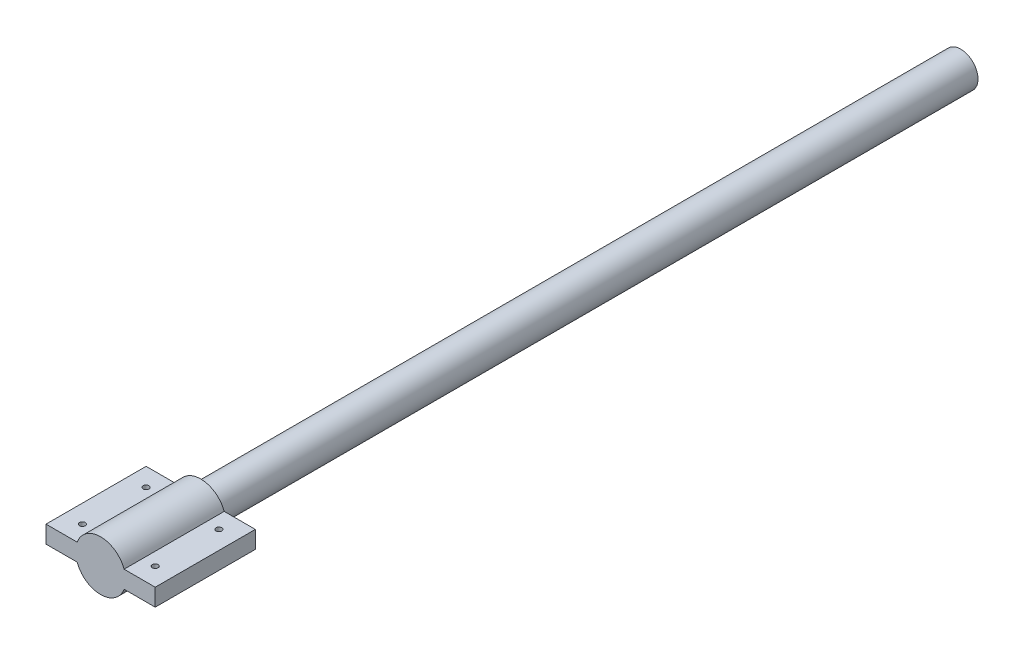
ISO-10303-21;
HEADER;
FILE_DESCRIPTION(('STEP AP214'),'2;1');
FILE_NAME('part.step','',(''),(''),'','','');
FILE_SCHEMA(('AUTOMOTIVE_DESIGN { 1 0 10303 214 1 1 1 1 }'));
ENDSEC;
DATA;
#1=APPLICATION_CONTEXT('core data for automotive mechanical design processes');
#2=APPLICATION_PROTOCOL_DEFINITION('international standard','automotive_design',2000,#1);
#3=PRODUCT_CONTEXT('',#1,'mechanical');
#4=PRODUCT('Part','Part','',(#3));
#5=PRODUCT_RELATED_PRODUCT_CATEGORY('part','',(#4));
#6=PRODUCT_DEFINITION_FORMATION('','',#4);
#7=PRODUCT_DEFINITION_CONTEXT('part definition',#1,'design');
#8=PRODUCT_DEFINITION('design','',#6,#7);
#9=PRODUCT_DEFINITION_SHAPE('','',#8);
#10=(LENGTH_UNIT() NAMED_UNIT(*) SI_UNIT(.MILLI.,.METRE.));
#11=(NAMED_UNIT(*) PLANE_ANGLE_UNIT() SI_UNIT($,.RADIAN.));
#12=(NAMED_UNIT(*) SI_UNIT($,.STERADIAN.) SOLID_ANGLE_UNIT());
#13=UNCERTAINTY_MEASURE_WITH_UNIT(LENGTH_MEASURE(1.E-05),#10,'distance_accuracy_value','');
#14=(GEOMETRIC_REPRESENTATION_CONTEXT(3) GLOBAL_UNCERTAINTY_ASSIGNED_CONTEXT((#13)) GLOBAL_UNIT_ASSIGNED_CONTEXT((#10,
#11,#12)) REPRESENTATION_CONTEXT('',''));
#15=CARTESIAN_POINT('',(0.,0.,0.));
#16=DIRECTION('',(0.,0.,1.));
#17=DIRECTION('',(1.,0.,0.));
#18=AXIS2_PLACEMENT_3D('',#15,#16,#17);
#19=CARTESIAN_POINT('',(0.,0.,945.));
#20=DIRECTION('',(0.,0.,-1.));
#21=DIRECTION('',(-1.,0.,0.));
#22=AXIS2_PLACEMENT_3D('',#19,#20,#21);
#23=CYLINDRICAL_SURFACE('',#22,19.);
#24=CARTESIAN_POINT('',(0.,0.,0.));
#25=DIRECTION('',(0.,0.,1.));
#26=DIRECTION('',(1.,0.,0.));
#27=AXIS2_PLACEMENT_3D('',#24,#25,#26);
#28=CIRCLE('',#27,19.);
#29=CARTESIAN_POINT('',(19.,0.,0.));
#30=VERTEX_POINT('',#29);
#31=EDGE_CURVE('E85',#30,#30,#28,.T.);
#32=ORIENTED_EDGE('',*,*,#31,.T.);
#33=EDGE_LOOP('',(#32));
#34=FACE_BOUND('',#33,.T.);
#35=CARTESIAN_POINT('',(0.,0.,835.));
#36=DIRECTION('',(0.,0.,1.));
#37=DIRECTION('',(1.,0.,0.));
#38=AXIS2_PLACEMENT_3D('',#35,#36,#37);
#39=CIRCLE('',#38,19.);
#40=CARTESIAN_POINT('',(19.,0.,835.));
#41=VERTEX_POINT('',#40);
#42=EDGE_CURVE('E12',#41,#41,#39,.T.);
#43=ORIENTED_EDGE('',*,*,#42,.F.);
#44=EDGE_LOOP('',(#43));
#45=FACE_BOUND('',#44,.T.);
#46=ADVANCED_FACE('F79',(#34,#45),#23,.T.);
#47=CARTESIAN_POINT('',(0.,0.,0.));
#48=DIRECTION('',(0.,0.,1.));
#49=DIRECTION('',(1.,0.,0.));
#50=AXIS2_PLACEMENT_3D('',#47,#48,#49);
#51=PLANE('',#50);
#52=ORIENTED_EDGE('',*,*,#31,.F.);
#53=EDGE_LOOP('',(#52));
#54=FACE_BOUND('',#53,.T.);
#55=ADVANCED_FACE('F229',(#54),#51,.F.);
#56=CARTESIAN_POINT('',(0.,-9.525,835.));
#57=DIRECTION('',(0.,1.,0.));
#58=DIRECTION('',(-1.,0.,0.));
#59=AXIS2_PLACEMENT_3D('',#56,#57,#58);
#60=PLANE('',#59);
#61=CARTESIAN_POINT('',(-40.,-9.525,925.));
#62=DIRECTION('',(0.,1.,0.));
#63=DIRECTION('',(-1.,0.,0.));
#64=AXIS2_PLACEMENT_3D('',#61,#62,#63);
#65=CIRCLE('',#64,3.17499999999999);
#66=CARTESIAN_POINT('',(-43.175,-9.525,925.));
#67=VERTEX_POINT('',#66);
#68=EDGE_CURVE('E291',#67,#67,#65,.T.);
#69=ORIENTED_EDGE('',*,*,#68,.T.);
#70=EDGE_LOOP('',(#69));
#71=FACE_BOUND('',#70,.T.);
#72=CARTESIAN_POINT('',(-40.,-9.525,855.));
#73=DIRECTION('',(0.,1.,0.));
#74=DIRECTION('',(-1.,0.,0.));
#75=AXIS2_PLACEMENT_3D('',#72,#73,#74);
#76=CIRCLE('',#75,3.17499999999997);
#77=CARTESIAN_POINT('',(-43.175,-9.525,855.));
#78=VERTEX_POINT('',#77);
#79=EDGE_CURVE('E298',#78,#78,#76,.T.);
#80=ORIENTED_EDGE('',*,*,#79,.T.);
#81=EDGE_LOOP('',(#80));
#82=FACE_BOUND('',#81,.T.);
#83=DIRECTION('',(-1.,0.,0.));
#84=VECTOR('',#83,1.);
#85=CARTESIAN_POINT('',(0.,-9.525,945.));
#86=LINE('',#85,#84);
#87=CARTESIAN_POINT('',(-25.7977591081086,-9.525,945.));
#88=VERTEX_POINT('',#87);
#89=CARTESIAN_POINT('',(-60.,-9.525,945.));
#90=VERTEX_POINT('',#89);
#91=EDGE_CURVE('E194',#88,#90,#86,.T.);
#92=ORIENTED_EDGE('',*,*,#91,.T.);
#93=DIRECTION('',(0.,0.,1.));
#94=VECTOR('',#93,1.);
#95=CARTESIAN_POINT('',(-60.,-9.525,835.));
#96=LINE('',#95,#94);
#97=CARTESIAN_POINT('',(-60.,-9.525,835.));
#98=VERTEX_POINT('',#97);
#99=EDGE_CURVE('E183',#98,#90,#96,.T.);
#100=ORIENTED_EDGE('',*,*,#99,.F.);
#101=DIRECTION('',(-1.,0.,0.));
#102=VECTOR('',#101,1.);
#103=CARTESIAN_POINT('',(0.,-9.525,835.));
#104=LINE('',#103,#102);
#105=CARTESIAN_POINT('',(-25.7977591081086,-9.525,835.));
#106=VERTEX_POINT('',#105);
#107=EDGE_CURVE('E196',#106,#98,#104,.T.);
#108=ORIENTED_EDGE('',*,*,#107,.F.);
#109=DIRECTION('',(0.,0.,1.));
#110=VECTOR('',#109,1.);
#111=CARTESIAN_POINT('',(-25.7977591081086,-9.525,835.));
#112=LINE('',#111,#110);
#113=EDGE_CURVE('E91',#106,#88,#112,.T.);
#114=ORIENTED_EDGE('',*,*,#113,.T.);
#115=EDGE_LOOP('',(#92,#100,#108,#114));
#116=FACE_BOUND('',#115,.T.);
#117=ADVANCED_FACE('F217',(#71,#82,#116),#60,.F.);
#118=CARTESIAN_POINT('',(-60.,0.,835.));
#119=DIRECTION('',(1.,0.,0.));
#120=DIRECTION('',(0.,0.,-1.));
#121=AXIS2_PLACEMENT_3D('',#118,#119,#120);
#122=PLANE('',#121);
#123=DIRECTION('',(0.,1.,0.));
#124=VECTOR('',#123,1.);
#125=CARTESIAN_POINT('',(-60.,0.,945.));
#126=LINE('',#125,#124);
#127=CARTESIAN_POINT('',(-60.,9.525,945.));
#128=VERTEX_POINT('',#127);
#129=EDGE_CURVE('E282',#90,#128,#126,.T.);
#130=ORIENTED_EDGE('',*,*,#129,.T.);
#131=DIRECTION('',(0.,0.,1.));
#132=VECTOR('',#131,1.);
#133=CARTESIAN_POINT('',(-60.,9.525,835.));
#134=LINE('',#133,#132);
#135=CARTESIAN_POINT('',(-60.,9.525,835.));
#136=VERTEX_POINT('',#135);
#137=EDGE_CURVE('E186',#136,#128,#134,.T.);
#138=ORIENTED_EDGE('',*,*,#137,.F.);
#139=DIRECTION('',(0.,1.,0.));
#140=VECTOR('',#139,1.);
#141=CARTESIAN_POINT('',(-60.,0.,835.));
#142=LINE('',#141,#140);
#143=EDGE_CURVE('E287',#98,#136,#142,.T.);
#144=ORIENTED_EDGE('',*,*,#143,.F.);
#145=ORIENTED_EDGE('',*,*,#99,.T.);
#146=EDGE_LOOP('',(#130,#138,#144,#145));
#147=FACE_BOUND('',#146,.T.);
#148=ADVANCED_FACE('F239',(#147),#122,.F.);
#149=CARTESIAN_POINT('',(0.,9.525,835.));
#150=DIRECTION('',(0.,-1.,0.));
#151=DIRECTION('',(1.,0.,0.));
#152=AXIS2_PLACEMENT_3D('',#149,#150,#151);
#153=PLANE('',#152);
#154=CARTESIAN_POINT('',(-40.,9.525,925.));
#155=DIRECTION('',(0.,1.,0.));
#156=DIRECTION('',(-1.,0.,0.));
#157=AXIS2_PLACEMENT_3D('',#154,#155,#156);
#158=CIRCLE('',#157,3.17499999999999);
#159=CARTESIAN_POINT('',(-43.175,9.525,925.));
#160=VERTEX_POINT('',#159);
#161=EDGE_CURVE('E274',#160,#160,#158,.T.);
#162=ORIENTED_EDGE('',*,*,#161,.F.);
#163=EDGE_LOOP('',(#162));
#164=FACE_BOUND('',#163,.T.);
#165=CARTESIAN_POINT('',(-40.,9.525,855.));
#166=DIRECTION('',(0.,1.,0.));
#167=DIRECTION('',(-1.,0.,0.));
#168=AXIS2_PLACEMENT_3D('',#165,#166,#167);
#169=CIRCLE('',#168,3.17499999999997);
#170=CARTESIAN_POINT('',(-43.175,9.525,855.));
#171=VERTEX_POINT('',#170);
#172=EDGE_CURVE('E276',#171,#171,#169,.T.);
#173=ORIENTED_EDGE('',*,*,#172,.F.);
#174=EDGE_LOOP('',(#173));
#175=FACE_BOUND('',#174,.T.);
#176=DIRECTION('',(1.,0.,0.));
#177=VECTOR('',#176,1.);
#178=CARTESIAN_POINT('',(0.,9.525,945.));
#179=LINE('',#178,#177);
#180=CARTESIAN_POINT('',(-25.7977591081086,9.525,945.));
#181=VERTEX_POINT('',#180);
#182=EDGE_CURVE('E149',#128,#181,#179,.T.);
#183=ORIENTED_EDGE('',*,*,#182,.T.);
#184=DIRECTION('',(0.,0.,1.));
#185=VECTOR('',#184,1.);
#186=CARTESIAN_POINT('',(-25.7977591081086,9.525,835.));
#187=LINE('',#186,#185);
#188=CARTESIAN_POINT('',(-25.7977591081086,9.525,835.));
#189=VERTEX_POINT('',#188);
#190=EDGE_CURVE('E154',#189,#181,#187,.T.);
#191=ORIENTED_EDGE('',*,*,#190,.F.);
#192=DIRECTION('',(1.,0.,0.));
#193=VECTOR('',#192,1.);
#194=CARTESIAN_POINT('',(0.,9.525,835.));
#195=LINE('',#194,#193);
#196=EDGE_CURVE('E290',#136,#189,#195,.T.);
#197=ORIENTED_EDGE('',*,*,#196,.F.);
#198=ORIENTED_EDGE('',*,*,#137,.T.);
#199=EDGE_LOOP('',(#183,#191,#197,#198));
#200=FACE_BOUND('',#199,.T.);
#201=ADVANCED_FACE('F218',(#164,#175,#200),#153,.F.);
#202=CARTESIAN_POINT('',(0.,0.,835.));
#203=DIRECTION('',(0.,0.,1.));
#204=DIRECTION('',(1.,0.,0.));
#205=AXIS2_PLACEMENT_3D('',#202,#203,#204);
#206=PLANE('',#205);
#207=ORIENTED_EDGE('',*,*,#196,.T.);
#208=CARTESIAN_POINT('',(0.,0.,835.));
#209=DIRECTION('',(0.,0.,1.));
#210=DIRECTION('',(1.,0.,0.));
#211=AXIS2_PLACEMENT_3D('',#208,#209,#210);
#212=CIRCLE('',#211,27.5);
#213=CARTESIAN_POINT('',(25.7977591081086,9.525,835.));
#214=VERTEX_POINT('',#213);
#215=EDGE_CURVE('E182',#214,#189,#212,.T.);
#216=ORIENTED_EDGE('',*,*,#215,.F.);
#217=DIRECTION('',(-1.,0.,0.));
#218=VECTOR('',#217,1.);
#219=CARTESIAN_POINT('',(0.,9.52499999999999,835.));
#220=LINE('',#219,#218);
#221=CARTESIAN_POINT('',(60.,9.52500000000001,835.));
#222=VERTEX_POINT('',#221);
#223=EDGE_CURVE('E144',#222,#214,#220,.T.);
#224=ORIENTED_EDGE('',*,*,#223,.F.);
#225=DIRECTION('',(0.,1.,0.));
#226=VECTOR('',#225,1.);
#227=CARTESIAN_POINT('',(60.,0.,835.));
#228=LINE('',#227,#226);
#229=CARTESIAN_POINT('',(60.,-9.52500000000001,835.));
#230=VERTEX_POINT('',#229);
#231=EDGE_CURVE('E166',#230,#222,#228,.T.);
#232=ORIENTED_EDGE('',*,*,#231,.F.);
#233=DIRECTION('',(1.,0.,0.));
#234=VECTOR('',#233,1.);
#235=CARTESIAN_POINT('',(0.,-9.52499999999999,835.));
#236=LINE('',#235,#234);
#237=CARTESIAN_POINT('',(25.7977591081086,-9.525,835.));
#238=VERTEX_POINT('',#237);
#239=EDGE_CURVE('E167',#238,#230,#236,.T.);
#240=ORIENTED_EDGE('',*,*,#239,.F.);
#241=EDGE_CURVE('E157',#106,#238,#212,.T.);
#242=ORIENTED_EDGE('',*,*,#241,.F.);
#243=ORIENTED_EDGE('',*,*,#107,.T.);
#244=ORIENTED_EDGE('',*,*,#143,.T.);
#245=EDGE_LOOP('',(#207,#216,#224,#232,#240,#242,#243,#244));
#246=FACE_BOUND('',#245,.T.);
#247=ORIENTED_EDGE('',*,*,#42,.T.);
#248=EDGE_LOOP('',(#247));
#249=FACE_BOUND('',#248,.T.);
#250=ADVANCED_FACE('F207',(#246,#249),#206,.F.);
#251=CARTESIAN_POINT('',(60.,0.,835.));
#252=DIRECTION('',(1.,0.,0.));
#253=DIRECTION('',(0.,0.,-1.));
#254=AXIS2_PLACEMENT_3D('',#251,#252,#253);
#255=PLANE('',#254);
#256=DIRECTION('',(0.,1.,0.));
#257=VECTOR('',#256,1.);
#258=CARTESIAN_POINT('',(60.,0.,945.));
#259=LINE('',#258,#257);
#260=CARTESIAN_POINT('',(60.,-9.52500000000001,945.));
#261=VERTEX_POINT('',#260);
#262=CARTESIAN_POINT('',(60.,9.52500000000001,945.));
#263=VERTEX_POINT('',#262);
#264=EDGE_CURVE('E164',#261,#263,#259,.T.);
#265=ORIENTED_EDGE('',*,*,#264,.F.);
#266=DIRECTION('',(0.,0.,1.));
#267=VECTOR('',#266,1.);
#268=CARTESIAN_POINT('',(60.,-9.52500000000001,835.));
#269=LINE('',#268,#267);
#270=EDGE_CURVE('E176',#230,#261,#269,.T.);
#271=ORIENTED_EDGE('',*,*,#270,.F.);
#272=ORIENTED_EDGE('',*,*,#231,.T.);
#273=DIRECTION('',(0.,0.,1.));
#274=VECTOR('',#273,1.);
#275=CARTESIAN_POINT('',(60.,9.52500000000001,835.));
#276=LINE('',#275,#274);
#277=EDGE_CURVE('E132',#222,#263,#276,.T.);
#278=ORIENTED_EDGE('',*,*,#277,.T.);
#279=EDGE_LOOP('',(#265,#271,#272,#278));
#280=FACE_BOUND('',#279,.T.);
#281=ADVANCED_FACE('F210',(#280),#255,.T.);
#282=CARTESIAN_POINT('',(0.,-9.52499999999999,835.));
#283=DIRECTION('',(0.,-1.,0.));
#284=DIRECTION('',(1.,0.,0.));
#285=AXIS2_PLACEMENT_3D('',#282,#283,#284);
#286=PLANE('',#285);
#287=CARTESIAN_POINT('',(40.,-9.52500000000001,855.));
#288=DIRECTION('',(0.,-1.,0.));
#289=DIRECTION('',(1.,0.,0.));
#290=AXIS2_PLACEMENT_3D('',#287,#288,#289);
#291=CIRCLE('',#290,3.17499999999998);
#292=CARTESIAN_POINT('',(43.175,-9.52500000000001,855.));
#293=VERTEX_POINT('',#292);
#294=EDGE_CURVE('E300',#293,#293,#291,.T.);
#295=ORIENTED_EDGE('',*,*,#294,.F.);
#296=EDGE_LOOP('',(#295));
#297=FACE_BOUND('',#296,.T.);
#298=CARTESIAN_POINT('',(40.,-9.52500000000001,925.));
#299=DIRECTION('',(0.,-1.,0.));
#300=DIRECTION('',(1.,0.,0.));
#301=AXIS2_PLACEMENT_3D('',#298,#299,#300);
#302=CIRCLE('',#301,3.17500000000004);
#303=CARTESIAN_POINT('',(43.175,-9.52500000000001,925.));
#304=VERTEX_POINT('',#303);
#305=EDGE_CURVE('E302',#304,#304,#302,.T.);
#306=ORIENTED_EDGE('',*,*,#305,.F.);
#307=EDGE_LOOP('',(#306));
#308=FACE_BOUND('',#307,.T.);
#309=DIRECTION('',(1.,0.,0.));
#310=VECTOR('',#309,1.);
#311=CARTESIAN_POINT('',(0.,-9.52499999999999,945.));
#312=LINE('',#311,#310);
#313=CARTESIAN_POINT('',(25.7977591081086,-9.525,945.));
#314=VERTEX_POINT('',#313);
#315=EDGE_CURVE('E173',#314,#261,#312,.T.);
#316=ORIENTED_EDGE('',*,*,#315,.F.);
#317=DIRECTION('',(0.,0.,1.));
#318=VECTOR('',#317,1.);
#319=CARTESIAN_POINT('',(25.7977591081086,-9.525,835.));
#320=LINE('',#319,#318);
#321=EDGE_CURVE('E179',#238,#314,#320,.T.);
#322=ORIENTED_EDGE('',*,*,#321,.F.);
#323=ORIENTED_EDGE('',*,*,#239,.T.);
#324=ORIENTED_EDGE('',*,*,#270,.T.);
#325=EDGE_LOOP('',(#316,#322,#323,#324));
#326=FACE_BOUND('',#325,.T.);
#327=ADVANCED_FACE('F204',(#297,#308,#326),#286,.T.);
#328=CARTESIAN_POINT('',(0.,9.52499999999999,835.));
#329=DIRECTION('',(0.,1.,0.));
#330=DIRECTION('',(-1.,0.,0.));
#331=AXIS2_PLACEMENT_3D('',#328,#329,#330);
#332=PLANE('',#331);
#333=CARTESIAN_POINT('',(40.,9.525,855.));
#334=DIRECTION('',(0.,1.,0.));
#335=DIRECTION('',(-1.,0.,0.));
#336=AXIS2_PLACEMENT_3D('',#333,#334,#335);
#337=CIRCLE('',#336,3.17499999999998);
#338=CARTESIAN_POINT('',(36.825,9.525,855.));
#339=VERTEX_POINT('',#338);
#340=EDGE_CURVE('E307',#339,#339,#337,.T.);
#341=ORIENTED_EDGE('',*,*,#340,.F.);
#342=EDGE_LOOP('',(#341));
#343=FACE_BOUND('',#342,.T.);
#344=CARTESIAN_POINT('',(40.,9.525,925.));
#345=DIRECTION('',(0.,1.,0.));
#346=DIRECTION('',(-1.,0.,0.));
#347=AXIS2_PLACEMENT_3D('',#344,#345,#346);
#348=CIRCLE('',#347,3.17500000000004);
#349=CARTESIAN_POINT('',(36.825,9.525,925.));
#350=VERTEX_POINT('',#349);
#351=EDGE_CURVE('E303',#350,#350,#348,.T.);
#352=ORIENTED_EDGE('',*,*,#351,.F.);
#353=EDGE_LOOP('',(#352));
#354=FACE_BOUND('',#353,.T.);
#355=DIRECTION('',(-1.,0.,0.));
#356=VECTOR('',#355,1.);
#357=CARTESIAN_POINT('',(0.,9.52499999999999,945.));
#358=LINE('',#357,#356);
#359=CARTESIAN_POINT('',(25.7977591081086,9.525,945.));
#360=VERTEX_POINT('',#359);
#361=EDGE_CURVE('E141',#263,#360,#358,.T.);
#362=ORIENTED_EDGE('',*,*,#361,.F.);
#363=ORIENTED_EDGE('',*,*,#277,.F.);
#364=ORIENTED_EDGE('',*,*,#223,.T.);
#365=DIRECTION('',(0.,0.,1.));
#366=VECTOR('',#365,1.);
#367=CARTESIAN_POINT('',(25.7977591081086,9.525,835.));
#368=LINE('',#367,#366);
#369=EDGE_CURVE('E138',#214,#360,#368,.T.);
#370=ORIENTED_EDGE('',*,*,#369,.T.);
#371=EDGE_LOOP('',(#362,#363,#364,#370));
#372=FACE_BOUND('',#371,.T.);
#373=ADVANCED_FACE('F143',(#343,#354,#372),#332,.T.);
#374=CARTESIAN_POINT('',(0.,0.,835.));
#375=DIRECTION('',(0.,0.,1.));
#376=DIRECTION('',(1.,0.,0.));
#377=AXIS2_PLACEMENT_3D('',#374,#375,#376);
#378=CYLINDRICAL_SURFACE('',#377,27.5);
#379=ORIENTED_EDGE('',*,*,#113,.F.);
#380=ORIENTED_EDGE('',*,*,#241,.T.);
#381=ORIENTED_EDGE('',*,*,#321,.T.);
#382=CARTESIAN_POINT('',(0.,0.,945.));
#383=DIRECTION('',(0.,0.,1.));
#384=DIRECTION('',(1.,0.,0.));
#385=AXIS2_PLACEMENT_3D('',#382,#383,#384);
#386=CIRCLE('',#385,27.5);
#387=EDGE_CURVE('E159',#88,#314,#386,.T.);
#388=ORIENTED_EDGE('',*,*,#387,.F.);
#389=EDGE_LOOP('',(#379,#380,#381,#388));
#390=FACE_BOUND('',#389,.T.);
#391=ADVANCED_FACE('F221',(#390),#378,.T.);
#392=ORIENTED_EDGE('',*,*,#190,.T.);
#393=EDGE_CURVE('E155',#360,#181,#386,.T.);
#394=ORIENTED_EDGE('',*,*,#393,.F.);
#395=ORIENTED_EDGE('',*,*,#369,.F.);
#396=ORIENTED_EDGE('',*,*,#215,.T.);
#397=EDGE_LOOP('',(#392,#394,#395,#396));
#398=FACE_BOUND('',#397,.T.);
#399=ADVANCED_FACE('F153',(#398),#378,.T.);
#400=CARTESIAN_POINT('',(0.,0.,945.));
#401=DIRECTION('',(0.,0.,1.));
#402=DIRECTION('',(1.,0.,0.));
#403=AXIS2_PLACEMENT_3D('',#400,#401,#402);
#404=PLANE('',#403);
#405=ORIENTED_EDGE('',*,*,#91,.F.);
#406=ORIENTED_EDGE('',*,*,#387,.T.);
#407=ORIENTED_EDGE('',*,*,#315,.T.);
#408=ORIENTED_EDGE('',*,*,#264,.T.);
#409=ORIENTED_EDGE('',*,*,#361,.T.);
#410=ORIENTED_EDGE('',*,*,#393,.T.);
#411=ORIENTED_EDGE('',*,*,#182,.F.);
#412=ORIENTED_EDGE('',*,*,#129,.F.);
#413=EDGE_LOOP('',(#405,#406,#407,#408,#409,#410,#411,#412));
#414=FACE_BOUND('',#413,.T.);
#415=ADVANCED_FACE('F162',(#414),#404,.T.);
#416=CARTESIAN_POINT('',(40.,-27.5,925.));
#417=DIRECTION('',(0.,1.,0.));
#418=DIRECTION('',(-1.,0.,0.));
#419=AXIS2_PLACEMENT_3D('',#416,#417,#418);
#420=CYLINDRICAL_SURFACE('',#419,3.17500000000004);
#421=ORIENTED_EDGE('',*,*,#305,.T.);
#422=EDGE_LOOP('',(#421));
#423=FACE_BOUND('',#422,.T.);
#424=ORIENTED_EDGE('',*,*,#351,.T.);
#425=EDGE_LOOP('',(#424));
#426=FACE_BOUND('',#425,.T.);
#427=ADVANCED_FACE('F249',(#423,#426),#420,.F.);
#428=CARTESIAN_POINT('',(40.,-27.5,855.));
#429=DIRECTION('',(0.,1.,0.));
#430=DIRECTION('',(-1.,0.,0.));
#431=AXIS2_PLACEMENT_3D('',#428,#429,#430);
#432=CYLINDRICAL_SURFACE('',#431,3.17499999999998);
#433=ORIENTED_EDGE('',*,*,#294,.T.);
#434=EDGE_LOOP('',(#433));
#435=FACE_BOUND('',#434,.T.);
#436=ORIENTED_EDGE('',*,*,#340,.T.);
#437=EDGE_LOOP('',(#436));
#438=FACE_BOUND('',#437,.T.);
#439=ADVANCED_FACE('F252',(#435,#438),#432,.F.);
#440=CARTESIAN_POINT('',(-40.,-27.5,855.));
#441=DIRECTION('',(0.,1.,0.));
#442=DIRECTION('',(-1.,0.,0.));
#443=AXIS2_PLACEMENT_3D('',#440,#441,#442);
#444=CYLINDRICAL_SURFACE('',#443,3.17499999999997);
#445=ORIENTED_EDGE('',*,*,#172,.T.);
#446=EDGE_LOOP('',(#445));
#447=FACE_BOUND('',#446,.T.);
#448=ORIENTED_EDGE('',*,*,#79,.F.);
#449=EDGE_LOOP('',(#448));
#450=FACE_BOUND('',#449,.T.);
#451=ADVANCED_FACE('F256',(#447,#450),#444,.F.);
#452=CARTESIAN_POINT('',(-40.,-27.5,925.));
#453=DIRECTION('',(0.,1.,0.));
#454=DIRECTION('',(-1.,0.,0.));
#455=AXIS2_PLACEMENT_3D('',#452,#453,#454);
#456=CYLINDRICAL_SURFACE('',#455,3.17499999999999);
#457=ORIENTED_EDGE('',*,*,#161,.T.);
#458=EDGE_LOOP('',(#457));
#459=FACE_BOUND('',#458,.T.);
#460=ORIENTED_EDGE('',*,*,#68,.F.);
#461=EDGE_LOOP('',(#460));
#462=FACE_BOUND('',#461,.T.);
#463=ADVANCED_FACE('F262',(#459,#462),#456,.F.);
#464=CLOSED_SHELL('',(#46,#55,#117,#148,#201,#250,#281,#327,#373,#391,#399,#415,#427,#439,#451,#463));
#465=MANIFOLD_SOLID_BREP('B2',#464);
#466=ADVANCED_BREP_SHAPE_REPRESENTATION('',(#18,#465),#14);
#467=SHAPE_DEFINITION_REPRESENTATION(#9,#466);
ENDSEC;
END-ISO-10303-21;
